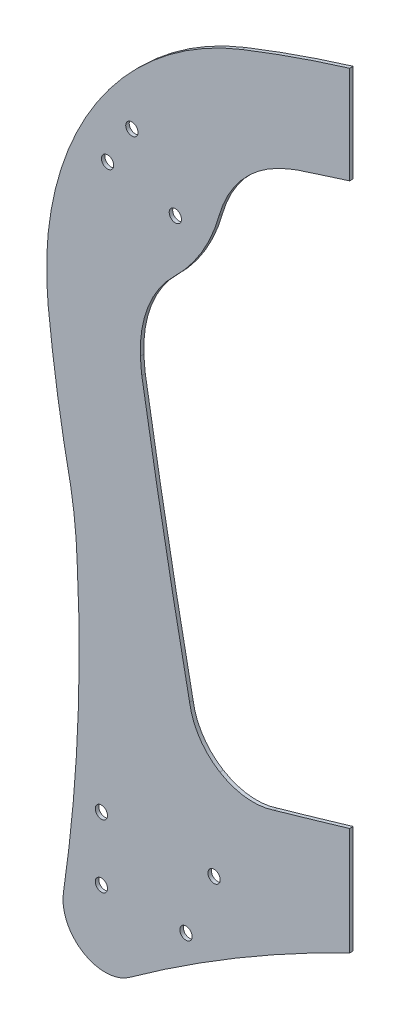
ISO-10303-21;
HEADER;
FILE_DESCRIPTION(('STEP AP214'),'2;1');
FILE_NAME('part.step','',(''),(''),'','','');
FILE_SCHEMA(('AUTOMOTIVE_DESIGN { 1 0 10303 214 1 1 1 1 }'));
ENDSEC;
DATA;
#1=APPLICATION_CONTEXT('core data for automotive mechanical design processes');
#2=APPLICATION_PROTOCOL_DEFINITION('international standard','automotive_design',2000,#1);
#3=PRODUCT_CONTEXT('',#1,'mechanical');
#4=PRODUCT('Part','Part','',(#3));
#5=PRODUCT_RELATED_PRODUCT_CATEGORY('part','',(#4));
#6=PRODUCT_DEFINITION_FORMATION('','',#4);
#7=PRODUCT_DEFINITION_CONTEXT('part definition',#1,'design');
#8=PRODUCT_DEFINITION('design','',#6,#7);
#9=PRODUCT_DEFINITION_SHAPE('','',#8);
#10=(LENGTH_UNIT() NAMED_UNIT(*) SI_UNIT(.MILLI.,.METRE.));
#11=(NAMED_UNIT(*) PLANE_ANGLE_UNIT() SI_UNIT($,.RADIAN.));
#12=(NAMED_UNIT(*) SI_UNIT($,.STERADIAN.) SOLID_ANGLE_UNIT());
#13=UNCERTAINTY_MEASURE_WITH_UNIT(LENGTH_MEASURE(1.E-05),#10,'distance_accuracy_value','');
#14=(GEOMETRIC_REPRESENTATION_CONTEXT(3) GLOBAL_UNCERTAINTY_ASSIGNED_CONTEXT((#13)) GLOBAL_UNIT_ASSIGNED_CONTEXT((#10,
#11,#12)) REPRESENTATION_CONTEXT('',''));
#15=CARTESIAN_POINT('',(0.,0.,0.));
#16=DIRECTION('',(0.,0.,1.));
#17=DIRECTION('',(1.,0.,0.));
#18=AXIS2_PLACEMENT_3D('',#15,#16,#17);
#19=CARTESIAN_POINT('',(-596.9,-624.582509856691,0.));
#20=DIRECTION('',(1.,0.,0.));
#21=DIRECTION('',(0.,0.,-1.));
#22=AXIS2_PLACEMENT_3D('',#19,#20,#21);
#23=PLANE('',#22);
#24=DIRECTION('',(0.,0.,-1.));
#25=VECTOR('',#24,1.);
#26=CARTESIAN_POINT('',(-596.9,-441.82233316805,6.35));
#27=LINE('',#26,#25);
#28=CARTESIAN_POINT('',(-596.9,-441.82233316805,0.));
#29=VERTEX_POINT('',#28);
#30=CARTESIAN_POINT('',(-596.9,-441.82233316805,6.35));
#31=VERTEX_POINT('',#30);
#32=EDGE_CURVE('E262',#29,#31,#27,.F.);
#33=ORIENTED_EDGE('',*,*,#32,.F.);
#34=DIRECTION('',(0.,1.,0.));
#35=VECTOR('',#34,1.);
#36=CARTESIAN_POINT('',(-596.9,-2169.24955294867,0.));
#37=LINE('',#36,#35);
#38=CARTESIAN_POINT('',(-596.9,-246.912409222542,0.));
#39=VERTEX_POINT('',#38);
#40=EDGE_CURVE('E263',#29,#39,#37,.T.);
#41=ORIENTED_EDGE('',*,*,#40,.T.);
#42=DIRECTION('',(0.,0.,-1.));
#43=VECTOR('',#42,1.);
#44=CARTESIAN_POINT('',(-596.9,-246.912409222542,6.35));
#45=LINE('',#44,#43);
#46=CARTESIAN_POINT('',(-596.9,-246.912409222542,6.35));
#47=VERTEX_POINT('',#46);
#48=EDGE_CURVE('E267',#47,#39,#45,.T.);
#49=ORIENTED_EDGE('',*,*,#48,.F.);
#50=DIRECTION('',(0.,1.,0.));
#51=VECTOR('',#50,1.);
#52=CARTESIAN_POINT('',(-596.9,-2169.24955294867,6.35));
#53=LINE('',#52,#51);
#54=EDGE_CURVE('E266',#31,#47,#53,.T.);
#55=ORIENTED_EDGE('',*,*,#54,.F.);
#56=EDGE_LOOP('',(#33,#41,#49,#55));
#57=FACE_BOUND('',#56,.T.);
#58=ADVANCED_FACE('F34',(#57),#23,.T.);
#59=CARTESIAN_POINT('',(-596.9,767.652698165207,0.));
#60=VERTEX_POINT('',#59);
#61=CARTESIAN_POINT('',(-596.9,944.092786482488,0.));
#62=VERTEX_POINT('',#61);
#63=EDGE_CURVE('E274',#60,#62,#37,.T.);
#64=ORIENTED_EDGE('',*,*,#63,.T.);
#65=DIRECTION('',(0.,0.,-1.));
#66=VECTOR('',#65,1.);
#67=CARTESIAN_POINT('',(-596.9,944.092786482488,6.35));
#68=LINE('',#67,#66);
#69=CARTESIAN_POINT('',(-596.9,944.092786482488,6.35));
#70=VERTEX_POINT('',#69);
#71=EDGE_CURVE('E259',#62,#70,#68,.F.);
#72=ORIENTED_EDGE('',*,*,#71,.T.);
#73=CARTESIAN_POINT('',(-596.9,767.652698165207,6.35));
#74=VERTEX_POINT('',#73);
#75=EDGE_CURVE('E38',#74,#70,#53,.T.);
#76=ORIENTED_EDGE('',*,*,#75,.F.);
#77=DIRECTION('',(0.,0.,-1.));
#78=VECTOR('',#77,1.);
#79=CARTESIAN_POINT('',(-596.9,767.652698165207,6.35));
#80=LINE('',#79,#78);
#81=EDGE_CURVE('E264',#60,#74,#80,.F.);
#82=ORIENTED_EDGE('',*,*,#81,.F.);
#83=EDGE_LOOP('',(#64,#72,#76,#82));
#84=FACE_BOUND('',#83,.T.);
#85=ADVANCED_FACE('F409',(#84),#23,.T.);
#86=CARTESIAN_POINT('',(153.596244838655,-1521.42780684033,6.35));
#87=DIRECTION('',(0.,0.,-1.));
#88=DIRECTION('',(-1.,0.,0.));
#89=AXIS2_PLACEMENT_3D('',#86,#87,#88);
#90=CYLINDRICAL_SURFACE('',#89,2577.21485515194);
#91=ORIENTED_EDGE('',*,*,#71,.F.);
#92=CARTESIAN_POINT('',(153.596244838655,-1521.42780684033,0.));
#93=DIRECTION('',(0.,0.,1.));
#94=DIRECTION('',(1.,0.,0.));
#95=AXIS2_PLACEMENT_3D('',#92,#93,#94);
#96=CIRCLE('',#95,2577.21485515194);
#97=CARTESIAN_POINT('',(-791.407826105621,876.280206140935,0.));
#98=VERTEX_POINT('',#97);
#99=EDGE_CURVE('E253',#62,#98,#96,.T.);
#100=ORIENTED_EDGE('',*,*,#99,.T.);
#101=DIRECTION('',(0.,0.,-1.));
#102=VECTOR('',#101,1.);
#103=CARTESIAN_POINT('',(-791.407826105621,876.280206140935,6.35));
#104=LINE('',#103,#102);
#105=CARTESIAN_POINT('',(-791.407826105621,876.280206140935,6.35));
#106=VERTEX_POINT('',#105);
#107=EDGE_CURVE('E311',#106,#98,#104,.T.);
#108=ORIENTED_EDGE('',*,*,#107,.F.);
#109=CARTESIAN_POINT('',(153.596244838655,-1521.42780684033,6.35));
#110=DIRECTION('',(0.,0.,1.));
#111=DIRECTION('',(1.,0.,0.));
#112=AXIS2_PLACEMENT_3D('',#109,#110,#111);
#113=CIRCLE('',#112,2577.21485515194);
#114=EDGE_CURVE('E203',#70,#106,#113,.T.);
#115=ORIENTED_EDGE('',*,*,#114,.F.);
#116=EDGE_LOOP('',(#91,#100,#108,#115));
#117=FACE_BOUND('',#116,.T.);
#118=ADVANCED_FACE('F433',(#117),#90,.T.);
#119=CARTESIAN_POINT('',(577.914172720366,-2865.04040656693,6.35));
#120=DIRECTION('',(0.,0.,-1.));
#121=DIRECTION('',(-1.,0.,0.));
#122=AXIS2_PLACEMENT_3D('',#119,#120,#121);
#123=CYLINDRICAL_SURFACE('',#122,2692.98610684712);
#124=CARTESIAN_POINT('',(577.914172720366,-2865.04040656693,0.));
#125=DIRECTION('',(0.,0.,1.));
#126=DIRECTION('',(1.,0.,0.));
#127=AXIS2_PLACEMENT_3D('',#124,#125,#126);
#128=CIRCLE('',#127,2692.98610684712);
#129=CARTESIAN_POINT('',(-994.915452979234,-679.089551631423,0.));
#130=VERTEX_POINT('',#129);
#131=EDGE_CURVE('E117',#29,#130,#128,.T.);
#132=ORIENTED_EDGE('',*,*,#131,.F.);
#133=ORIENTED_EDGE('',*,*,#32,.T.);
#134=CARTESIAN_POINT('',(577.914172720366,-2865.04040656693,6.35));
#135=DIRECTION('',(0.,0.,1.));
#136=DIRECTION('',(1.,0.,0.));
#137=AXIS2_PLACEMENT_3D('',#134,#135,#136);
#138=CIRCLE('',#137,2692.98610684712);
#139=CARTESIAN_POINT('',(-994.915452979234,-679.089551631423,6.35));
#140=VERTEX_POINT('',#139);
#141=EDGE_CURVE('E192',#31,#140,#138,.T.);
#142=ORIENTED_EDGE('',*,*,#141,.T.);
#143=DIRECTION('',(0.,0.,-1.));
#144=VECTOR('',#143,1.);
#145=CARTESIAN_POINT('',(-994.915452979234,-679.089551631423,6.35));
#146=LINE('',#145,#144);
#147=EDGE_CURVE('E333',#140,#130,#146,.T.);
#148=ORIENTED_EDGE('',*,*,#147,.T.);
#149=EDGE_LOOP('',(#132,#133,#142,#148));
#150=FACE_BOUND('',#149,.T.);
#151=ADVANCED_FACE('F435',(#150),#123,.F.);
#152=CARTESIAN_POINT('',(-4330.12511720553,12331.960297847,6.35));
#153=DIRECTION('',(0.,0.,-1.));
#154=DIRECTION('',(-1.,0.,0.));
#155=AXIS2_PLACEMENT_3D('',#152,#153,#154);
#156=CYLINDRICAL_SURFACE('',#155,13121.1664251465);
#157=CARTESIAN_POINT('',(-4330.12511720553,12331.960297847,6.35));
#158=DIRECTION('',(0.,0.,1.));
#159=DIRECTION('',(1.,0.,0.));
#160=AXIS2_PLACEMENT_3D('',#157,#158,#159);
#161=CIRCLE('',#160,13121.1664251465);
#162=CARTESIAN_POINT('',(-734.160728685571,-286.837127933736,6.35));
#163=VERTEX_POINT('',#162);
#164=EDGE_CURVE('E248',#163,#47,#161,.T.);
#165=ORIENTED_EDGE('',*,*,#164,.T.);
#166=ORIENTED_EDGE('',*,*,#48,.T.);
#167=CARTESIAN_POINT('',(-4330.12511720553,12331.960297847,0.));
#168=DIRECTION('',(0.,0.,1.));
#169=DIRECTION('',(1.,0.,0.));
#170=AXIS2_PLACEMENT_3D('',#167,#168,#169);
#171=CIRCLE('',#170,13121.1664251465);
#172=CARTESIAN_POINT('',(-734.160728685571,-286.837127933736,0.));
#173=VERTEX_POINT('',#172);
#174=EDGE_CURVE('E11',#173,#39,#171,.T.);
#175=ORIENTED_EDGE('',*,*,#174,.F.);
#176=DIRECTION('',(0.,0.,-1.));
#177=VECTOR('',#176,1.);
#178=CARTESIAN_POINT('',(-734.160728685571,-286.837127933736,6.35));
#179=LINE('',#178,#177);
#180=EDGE_CURVE('E53',#163,#173,#179,.T.);
#181=ORIENTED_EDGE('',*,*,#180,.F.);
#182=EDGE_LOOP('',(#165,#166,#175,#181));
#183=FACE_BOUND('',#182,.T.);
#184=ADVANCED_FACE('F282',(#183),#156,.F.);
#185=CARTESIAN_POINT('',(3360.15803335572,-11742.6110911019,6.35));
#186=DIRECTION('',(0.,0.,-1.));
#187=DIRECTION('',(-1.,0.,0.));
#188=AXIS2_PLACEMENT_3D('',#185,#186,#187);
#189=CYLINDRICAL_SURFACE('',#188,13121.1664251465);
#190=CARTESIAN_POINT('',(3360.15803335572,-11742.6110911019,0.));
#191=DIRECTION('',(0.,0.,1.));
#192=DIRECTION('',(1.,0.,0.));
#193=AXIS2_PLACEMENT_3D('',#190,#191,#192);
#194=CIRCLE('',#193,13121.1664251465);
#195=CARTESIAN_POINT('',(-691.89063245382,737.209018431093,0.));
#196=VERTEX_POINT('',#195);
#197=EDGE_CURVE('E249',#60,#196,#194,.T.);
#198=ORIENTED_EDGE('',*,*,#197,.F.);
#199=ORIENTED_EDGE('',*,*,#81,.T.);
#200=CARTESIAN_POINT('',(3360.15803335572,-11742.6110911019,6.35));
#201=DIRECTION('',(0.,0.,1.));
#202=DIRECTION('',(1.,0.,0.));
#203=AXIS2_PLACEMENT_3D('',#200,#201,#202);
#204=CIRCLE('',#203,13121.1664251465);
#205=CARTESIAN_POINT('',(-691.89063245382,737.209018431093,6.35));
#206=VERTEX_POINT('',#205);
#207=EDGE_CURVE('E225',#74,#206,#204,.T.);
#208=ORIENTED_EDGE('',*,*,#207,.T.);
#209=DIRECTION('',(0.,0.,-1.));
#210=VECTOR('',#209,1.);
#211=CARTESIAN_POINT('',(-691.89063245382,737.209018431093,6.35));
#212=LINE('',#211,#210);
#213=EDGE_CURVE('E273',#206,#196,#212,.T.);
#214=ORIENTED_EDGE('',*,*,#213,.T.);
#215=EDGE_LOOP('',(#198,#199,#208,#214));
#216=FACE_BOUND('',#215,.T.);
#217=ADVANCED_FACE('F403',(#216),#189,.F.);
#218=CARTESIAN_POINT('',(-10.0304702545167,-2169.24955294867,6.35));
#219=DIRECTION('',(0.,0.,1.));
#220=DIRECTION('',(1.,0.,0.));
#221=AXIS2_PLACEMENT_3D('',#218,#219,#220);
#222=PLANE('',#221);
#223=CARTESIAN_POINT('',(-842.317492798119,-444.618230590805,6.35));
#224=DIRECTION('',(0.,0.,1.));
#225=DIRECTION('',(1.,0.,0.));
#226=AXIS2_PLACEMENT_3D('',#223,#224,#225);
#227=CIRCLE('',#226,11.1124999999994);
#228=CARTESIAN_POINT('',(-831.20499279812,-444.618230590805,6.35));
#229=VERTEX_POINT('',#228);
#230=EDGE_CURVE('E222',#229,#229,#227,.T.);
#231=ORIENTED_EDGE('',*,*,#230,.F.);
#232=EDGE_LOOP('',(#231));
#233=FACE_BOUND('',#232,.T.);
#234=CARTESIAN_POINT('',(-893.117492798119,-558.918230590805,6.35));
#235=DIRECTION('',(0.,0.,1.));
#236=DIRECTION('',(1.,0.,0.));
#237=AXIS2_PLACEMENT_3D('',#234,#235,#236);
#238=CIRCLE('',#237,11.1124999999994);
#239=CARTESIAN_POINT('',(-882.004992798119,-558.918230590805,6.35));
#240=VERTEX_POINT('',#239);
#241=EDGE_CURVE('E219',#240,#240,#238,.T.);
#242=ORIENTED_EDGE('',*,*,#241,.F.);
#243=EDGE_LOOP('',(#242));
#244=FACE_BOUND('',#243,.T.);
#245=CARTESIAN_POINT('',(-1046.16708396435,-445.853855558227,6.35));
#246=DIRECTION('',(0.,0.,1.));
#247=DIRECTION('',(1.,0.,0.));
#248=AXIS2_PLACEMENT_3D('',#245,#246,#247);
#249=CIRCLE('',#248,11.1124999999994);
#250=CARTESIAN_POINT('',(-1035.05458396435,-445.853855558227,6.35));
#251=VERTEX_POINT('',#250);
#252=EDGE_CURVE('E216',#251,#251,#249,.T.);
#253=ORIENTED_EDGE('',*,*,#252,.F.);
#254=EDGE_LOOP('',(#253));
#255=FACE_BOUND('',#254,.T.);
#256=CARTESIAN_POINT('',(-1046.16708396435,-560.153855558227,6.35));
#257=DIRECTION('',(0.,0.,1.));
#258=DIRECTION('',(1.,0.,0.));
#259=AXIS2_PLACEMENT_3D('',#256,#257,#258);
#260=CIRCLE('',#259,11.1124999999994);
#261=CARTESIAN_POINT('',(-1035.05458396435,-560.153855558227,6.35));
#262=VERTEX_POINT('',#261);
#263=EDGE_CURVE('E213',#262,#262,#260,.T.);
#264=ORIENTED_EDGE('',*,*,#263,.F.);
#265=EDGE_LOOP('',(#264));
#266=FACE_BOUND('',#265,.T.);
#267=CARTESIAN_POINT('',(-912.392953219633,555.218585094677,6.35));
#268=DIRECTION('',(0.,0.,1.));
#269=DIRECTION('',(1.,0.,0.));
#270=AXIS2_PLACEMENT_3D('',#267,#268,#269);
#271=CIRCLE('',#270,11.1125000000003);
#272=CARTESIAN_POINT('',(-901.280453219632,555.218585094677,6.35));
#273=VERTEX_POINT('',#272);
#274=EDGE_CURVE('E210',#273,#273,#271,.T.);
#275=ORIENTED_EDGE('',*,*,#274,.F.);
#276=EDGE_LOOP('',(#275));
#277=FACE_BOUND('',#276,.T.);
#278=CARTESIAN_POINT('',(-991.017480219273,652.045444179052,6.35));
#279=DIRECTION('',(0.,0.,1.));
#280=DIRECTION('',(1.,0.,0.));
#281=AXIS2_PLACEMENT_3D('',#278,#279,#280);
#282=CIRCLE('',#281,11.1125000000003);
#283=CARTESIAN_POINT('',(-979.904980219272,652.045444179052,6.35));
#284=VERTEX_POINT('',#283);
#285=EDGE_CURVE('E207',#284,#284,#282,.T.);
#286=ORIENTED_EDGE('',*,*,#285,.F.);
#287=EDGE_LOOP('',(#286));
#288=FACE_BOUND('',#287,.T.);
#289=CARTESIAN_POINT('',(-1034.96338078354,578.321554013371,6.35));
#290=DIRECTION('',(0.,0.,1.));
#291=DIRECTION('',(1.,0.,0.));
#292=AXIS2_PLACEMENT_3D('',#289,#290,#291);
#293=CIRCLE('',#292,11.1125000000003);
#294=CARTESIAN_POINT('',(-1023.85088078354,578.321554013371,6.35));
#295=VERTEX_POINT('',#294);
#296=EDGE_CURVE('E204',#295,#295,#293,.T.);
#297=ORIENTED_EDGE('',*,*,#296,.F.);
#298=EDGE_LOOP('',(#297));
#299=FACE_BOUND('',#298,.T.);
#300=ORIENTED_EDGE('',*,*,#141,.F.);
#301=ORIENTED_EDGE('',*,*,#54,.T.);
#302=ORIENTED_EDGE('',*,*,#164,.F.);
#303=CARTESIAN_POINT('',(-771.519777385869,-176.749160683128,6.35));
#304=DIRECTION('',(0.,0.,1.));
#305=DIRECTION('',(1.,0.,0.));
#306=AXIS2_PLACEMENT_3D('',#303,#304,#305);
#307=CIRCLE('',#306,116.254286171144);
#308=CARTESIAN_POINT('',(-831.914958660733,-276.084356520062,6.35));
#309=VERTEX_POINT('',#308);
#310=EDGE_CURVE('E246',#309,#163,#307,.T.);
#311=ORIENTED_EDGE('',*,*,#310,.F.);
#312=DIRECTION('',(0.854464804067926,-0.519509286355077,0.));
#313=VECTOR('',#312,1.);
#314=CARTESIAN_POINT('',(608.531783884307,-1151.86701683498,6.35));
#315=LINE('',#314,#313);
#316=CARTESIAN_POINT('',(-832.041240205875,-276.00757812605,6.35));
#317=VERTEX_POINT('',#316);
#318=EDGE_CURVE('E244',#317,#309,#315,.T.);
#319=ORIENTED_EDGE('',*,*,#318,.F.);
#320=CARTESIAN_POINT('',(-771.64605893101,-176.672382289116,6.35));
#321=DIRECTION('',(0.,0.,1.));
#322=DIRECTION('',(1.,0.,0.));
#323=AXIS2_PLACEMENT_3D('',#320,#321,#322);
#324=CIRCLE('',#323,116.254286171246);
#325=CARTESIAN_POINT('',(-886.576073784728,-194.169546028132,6.35));
#326=VERTEX_POINT('',#325);
#327=EDGE_CURVE('E167',#326,#317,#324,.T.);
#328=ORIENTED_EDGE('',*,*,#327,.F.);
#329=CARTESIAN_POINT('',(11971.3883272862,2420.74150737003,6.35));
#330=DIRECTION('',(0.,0.,1.));
#331=DIRECTION('',(1.,0.,0.));
#332=AXIS2_PLACEMENT_3D('',#329,#330,#331);
#333=CIRCLE('',#332,13121.1664251464);
#334=CARTESIAN_POINT('',(-973.090543461927,274.704433798743,6.35));
#335=VERTEX_POINT('',#334);
#336=EDGE_CURVE('E240',#335,#326,#333,.T.);
#337=ORIENTED_EDGE('',*,*,#336,.F.);
#338=CARTESIAN_POINT('',(-536.88973086258,325.638726740605,6.35));
#339=DIRECTION('',(0.,0.,1.));
#340=DIRECTION('',(1.,0.,0.));
#341=AXIS2_PLACEMENT_3D('',#338,#339,#340);
#342=CIRCLE('',#341,439.164492086756);
#343=CARTESIAN_POINT('',(-975.513775636944,303.858036770023,6.35));
#344=VERTEX_POINT('',#343);
#345=EDGE_CURVE('E237',#344,#335,#342,.T.);
#346=ORIENTED_EDGE('',*,*,#345,.F.);
#347=CARTESIAN_POINT('',(-772.563838872597,313.935892065246,6.35));
#348=DIRECTION('',(0.,0.,1.));
#349=DIRECTION('',(1.,0.,0.));
#350=AXIS2_PLACEMENT_3D('',#347,#348,#349);
#351=CIRCLE('',#350,203.200000000007);
#352=CARTESIAN_POINT('',(-913.897564598035,459.932528918868,6.35));
#353=VERTEX_POINT('',#352);
#354=EDGE_CURVE('E234',#353,#344,#351,.T.);
#355=ORIENTED_EDGE('',*,*,#354,.F.);
#356=CARTESIAN_POINT('',(-1123.81077439673,676.771238183477,6.35));
#357=DIRECTION('',(0.,0.,1.));
#358=DIRECTION('',(1.,0.,0.));
#359=AXIS2_PLACEMENT_3D('',#356,#357,#358);
#360=CIRCLE('',#359,301.798909016469);
#361=CARTESIAN_POINT('',(-833.367311335823,594.764066248819,6.35));
#362=VERTEX_POINT('',#361);
#363=EDGE_CURVE('E232',#353,#362,#360,.T.);
#364=ORIENTED_EDGE('',*,*,#363,.T.);
#365=CARTESIAN_POINT('',(-637.812887741983,539.54896493695,6.35));
#366=DIRECTION('',(0.,0.,1.));
#367=DIRECTION('',(1.,0.,0.));
#368=AXIS2_PLACEMENT_3D('',#365,#366,#367);
#369=CIRCLE('',#368,203.199999999998);
#370=CARTESIAN_POINT('',(-725.177038409833,723.009438004269,6.35));
#371=VERTEX_POINT('',#370);
#372=EDGE_CURVE('E229',#371,#362,#369,.T.);
#373=ORIENTED_EDGE('',*,*,#372,.F.);
#374=CARTESIAN_POINT('',(-536.361916093608,326.506852017079,6.35));
#375=DIRECTION('',(0.,0.,1.));
#376=DIRECTION('',(1.,0.,0.));
#377=AXIS2_PLACEMENT_3D('',#374,#375,#376);
#378=CIRCLE('',#377,439.164492086757);
#379=EDGE_CURVE('E226',#206,#371,#378,.T.);
#380=ORIENTED_EDGE('',*,*,#379,.F.);
#381=ORIENTED_EDGE('',*,*,#207,.F.);
#382=ORIENTED_EDGE('',*,*,#75,.T.);
#383=ORIENTED_EDGE('',*,*,#114,.T.);
#384=CARTESIAN_POINT('',(-586.509009157058,356.401456033668,6.35));
#385=DIRECTION('',(0.,0.,1.));
#386=DIRECTION('',(1.,0.,0.));
#387=AXIS2_PLACEMENT_3D('',#384,#385,#386);
#388=CIRCLE('',#387,558.800000000013);
#389=CARTESIAN_POINT('',(-1142.35843464081,299.052906013671,6.35));
#390=VERTEX_POINT('',#389);
#391=EDGE_CURVE('E200',#106,#390,#388,.T.);
#392=ORIENTED_EDGE('',*,*,#391,.T.);
#393=CARTESIAN_POINT('',(1421.24821636957,563.54742110072,6.35));
#394=DIRECTION('',(0.,0.,1.));
#395=DIRECTION('',(1.,0.,0.));
#396=AXIS2_PLACEMENT_3D('',#393,#394,#395);
#397=CIRCLE('',#396,2577.21485515194);
#398=CARTESIAN_POINT('',(-1101.53128595536,36.6508541495265,6.35));
#399=VERTEX_POINT('',#398);
#400=EDGE_CURVE('E198',#390,#399,#397,.T.);
#401=ORIENTED_EDGE('',*,*,#400,.T.);
#402=CARTESIAN_POINT('',(-1914.92938311946,-103.947752173305,6.35));
#403=DIRECTION('',(0.,0.,1.));
#404=DIRECTION('',(1.,0.,0.));
#405=AXIS2_PLACEMENT_3D('',#402,#403,#404);
#406=CIRCLE('',#405,825.46013384663);
#407=CARTESIAN_POINT('',(-1089.83566214046,-79.3553921580195,6.35));
#408=VERTEX_POINT('',#407);
#409=EDGE_CURVE('E195',#408,#399,#406,.T.);
#410=ORIENTED_EDGE('',*,*,#409,.F.);
#411=CARTESIAN_POINT('',(-3779.36069972374,-215.84438029698,6.35));
#412=DIRECTION('',(0.,0.,1.));
#413=DIRECTION('',(1.,0.,0.));
#414=AXIS2_PLACEMENT_3D('',#411,#412,#413);
#415=CIRCLE('',#414,2692.98610684712);
#416=CARTESIAN_POINT('',(-1114.81506697147,-606.191331934103,6.35));
#417=VERTEX_POINT('',#416);
#418=EDGE_CURVE('E191',#417,#408,#415,.T.);
#419=ORIENTED_EDGE('',*,*,#418,.F.);
#420=CARTESIAN_POINT('',(-1039.41981086547,-617.236482757399,6.35));
#421=DIRECTION('',(0.,0.,1.));
#422=DIRECTION('',(1.,0.,0.));
#423=AXIS2_PLACEMENT_3D('',#420,#421,#422);
#424=CIRCLE('',#423,76.1999999999967);
#425=EDGE_CURVE('E188',#417,#140,#424,.T.);
#426=ORIENTED_EDGE('',*,*,#425,.T.);
#427=EDGE_LOOP('',(#300,#301,#302,#311,#319,#328,#337,#346,#355,#364,#373,#380,#381,#382,#383,
#392,#401,#410,#419,#426));
#428=FACE_BOUND('',#427,.T.);
#429=ADVANCED_FACE('F36',(#233,#244,#255,#266,#277,#288,#299,#428),#222,.T.);
#430=CARTESIAN_POINT('',(-10.0304702545167,-2169.24955294867,0.));
#431=DIRECTION('',(0.,0.,1.));
#432=DIRECTION('',(1.,0.,0.));
#433=AXIS2_PLACEMENT_3D('',#430,#431,#432);
#434=PLANE('',#433);
#435=CARTESIAN_POINT('',(-842.317492798119,-444.618230590805,0.));
#436=DIRECTION('',(0.,0.,1.));
#437=DIRECTION('',(1.,0.,0.));
#438=AXIS2_PLACEMENT_3D('',#435,#436,#437);
#439=CIRCLE('',#438,11.1124999999994);
#440=CARTESIAN_POINT('',(-831.20499279812,-444.618230590805,0.));
#441=VERTEX_POINT('',#440);
#442=EDGE_CURVE('E252',#441,#441,#439,.T.);
#443=ORIENTED_EDGE('',*,*,#442,.T.);
#444=EDGE_LOOP('',(#443));
#445=FACE_BOUND('',#444,.T.);
#446=CARTESIAN_POINT('',(-893.117492798119,-558.918230590805,0.));
#447=DIRECTION('',(0.,0.,1.));
#448=DIRECTION('',(1.,0.,0.));
#449=AXIS2_PLACEMENT_3D('',#446,#447,#448);
#450=CIRCLE('',#449,11.1124999999994);
#451=CARTESIAN_POINT('',(-882.004992798119,-558.918230590805,0.));
#452=VERTEX_POINT('',#451);
#453=EDGE_CURVE('E361',#452,#452,#450,.T.);
#454=ORIENTED_EDGE('',*,*,#453,.T.);
#455=EDGE_LOOP('',(#454));
#456=FACE_BOUND('',#455,.T.);
#457=CARTESIAN_POINT('',(-1046.16708396435,-445.853855558227,0.));
#458=DIRECTION('',(0.,0.,1.));
#459=DIRECTION('',(1.,0.,0.));
#460=AXIS2_PLACEMENT_3D('',#457,#458,#459);
#461=CIRCLE('',#460,11.1124999999994);
#462=CARTESIAN_POINT('',(-1035.05458396435,-445.853855558227,0.));
#463=VERTEX_POINT('',#462);
#464=EDGE_CURVE('E358',#463,#463,#461,.T.);
#465=ORIENTED_EDGE('',*,*,#464,.T.);
#466=EDGE_LOOP('',(#465));
#467=FACE_BOUND('',#466,.T.);
#468=CARTESIAN_POINT('',(-1046.16708396435,-560.153855558227,0.));
#469=DIRECTION('',(0.,0.,1.));
#470=DIRECTION('',(1.,0.,0.));
#471=AXIS2_PLACEMENT_3D('',#468,#469,#470);
#472=CIRCLE('',#471,11.1124999999994);
#473=CARTESIAN_POINT('',(-1035.05458396435,-560.153855558227,0.));
#474=VERTEX_POINT('',#473);
#475=EDGE_CURVE('E355',#474,#474,#472,.T.);
#476=ORIENTED_EDGE('',*,*,#475,.T.);
#477=EDGE_LOOP('',(#476));
#478=FACE_BOUND('',#477,.T.);
#479=CARTESIAN_POINT('',(-912.392953219633,555.218585094677,0.));
#480=DIRECTION('',(0.,0.,1.));
#481=DIRECTION('',(1.,0.,0.));
#482=AXIS2_PLACEMENT_3D('',#479,#480,#481);
#483=CIRCLE('',#482,11.1125000000003);
#484=CARTESIAN_POINT('',(-901.280453219632,555.218585094677,0.));
#485=VERTEX_POINT('',#484);
#486=EDGE_CURVE('E352',#485,#485,#483,.T.);
#487=ORIENTED_EDGE('',*,*,#486,.T.);
#488=EDGE_LOOP('',(#487));
#489=FACE_BOUND('',#488,.T.);
#490=CARTESIAN_POINT('',(-991.017480219273,652.045444179052,0.));
#491=DIRECTION('',(0.,0.,1.));
#492=DIRECTION('',(1.,0.,0.));
#493=AXIS2_PLACEMENT_3D('',#490,#491,#492);
#494=CIRCLE('',#493,11.1125000000003);
#495=CARTESIAN_POINT('',(-979.904980219272,652.045444179052,0.));
#496=VERTEX_POINT('',#495);
#497=EDGE_CURVE('E349',#496,#496,#494,.T.);
#498=ORIENTED_EDGE('',*,*,#497,.T.);
#499=EDGE_LOOP('',(#498));
#500=FACE_BOUND('',#499,.T.);
#501=CARTESIAN_POINT('',(-1034.96338078354,578.321554013371,0.));
#502=DIRECTION('',(0.,0.,1.));
#503=DIRECTION('',(1.,0.,0.));
#504=AXIS2_PLACEMENT_3D('',#501,#502,#503);
#505=CIRCLE('',#504,11.1125000000003);
#506=CARTESIAN_POINT('',(-1023.85088078354,578.321554013371,0.));
#507=VERTEX_POINT('',#506);
#508=EDGE_CURVE('E255',#507,#507,#505,.T.);
#509=ORIENTED_EDGE('',*,*,#508,.T.);
#510=EDGE_LOOP('',(#509));
#511=FACE_BOUND('',#510,.T.);
#512=ORIENTED_EDGE('',*,*,#40,.F.);
#513=ORIENTED_EDGE('',*,*,#131,.T.);
#514=CARTESIAN_POINT('',(-1039.41981086547,-617.236482757399,0.));
#515=DIRECTION('',(0.,0.,1.));
#516=DIRECTION('',(1.,0.,0.));
#517=AXIS2_PLACEMENT_3D('',#514,#515,#516);
#518=CIRCLE('',#517,76.1999999999967);
#519=CARTESIAN_POINT('',(-1114.81506697147,-606.191331934103,0.));
#520=VERTEX_POINT('',#519);
#521=EDGE_CURVE('E270',#520,#130,#518,.T.);
#522=ORIENTED_EDGE('',*,*,#521,.F.);
#523=CARTESIAN_POINT('',(-3779.36069972374,-215.84438029698,0.));
#524=DIRECTION('',(0.,0.,1.));
#525=DIRECTION('',(1.,0.,0.));
#526=AXIS2_PLACEMENT_3D('',#523,#524,#525);
#527=CIRCLE('',#526,2692.98610684712);
#528=CARTESIAN_POINT('',(-1089.83566214046,-79.3553921580195,0.));
#529=VERTEX_POINT('',#528);
#530=EDGE_CURVE('E337',#520,#529,#527,.T.);
#531=ORIENTED_EDGE('',*,*,#530,.T.);
#532=CARTESIAN_POINT('',(-1914.92938311946,-103.947752173305,0.));
#533=DIRECTION('',(0.,0.,1.));
#534=DIRECTION('',(1.,0.,0.));
#535=AXIS2_PLACEMENT_3D('',#532,#533,#534);
#536=CIRCLE('',#535,825.46013384663);
#537=CARTESIAN_POINT('',(-1101.53128595536,36.6508541495265,0.));
#538=VERTEX_POINT('',#537);
#539=EDGE_CURVE('E340',#529,#538,#536,.T.);
#540=ORIENTED_EDGE('',*,*,#539,.T.);
#541=CARTESIAN_POINT('',(1421.24821636957,563.54742110072,0.));
#542=DIRECTION('',(0.,0.,1.));
#543=DIRECTION('',(1.,0.,0.));
#544=AXIS2_PLACEMENT_3D('',#541,#542,#543);
#545=CIRCLE('',#544,2577.21485515194);
#546=CARTESIAN_POINT('',(-1142.35843464081,299.052906013671,0.));
#547=VERTEX_POINT('',#546);
#548=EDGE_CURVE('E343',#547,#538,#545,.T.);
#549=ORIENTED_EDGE('',*,*,#548,.F.);
#550=CARTESIAN_POINT('',(-586.509009157058,356.401456033668,0.));
#551=DIRECTION('',(0.,0.,1.));
#552=DIRECTION('',(1.,0.,0.));
#553=AXIS2_PLACEMENT_3D('',#550,#551,#552);
#554=CIRCLE('',#553,558.800000000013);
#555=EDGE_CURVE('E256',#98,#547,#554,.T.);
#556=ORIENTED_EDGE('',*,*,#555,.F.);
#557=ORIENTED_EDGE('',*,*,#99,.F.);
#558=ORIENTED_EDGE('',*,*,#63,.F.);
#559=ORIENTED_EDGE('',*,*,#197,.T.);
#560=CARTESIAN_POINT('',(-536.361916093608,326.506852017079,0.));
#561=DIRECTION('',(0.,0.,1.));
#562=DIRECTION('',(1.,0.,0.));
#563=AXIS2_PLACEMENT_3D('',#560,#561,#562);
#564=CIRCLE('',#563,439.164492086757);
#565=CARTESIAN_POINT('',(-725.177038409833,723.009438004269,0.));
#566=VERTEX_POINT('',#565);
#567=EDGE_CURVE('E251',#196,#566,#564,.T.);
#568=ORIENTED_EDGE('',*,*,#567,.T.);
#569=CARTESIAN_POINT('',(-637.812887741983,539.54896493695,0.));
#570=DIRECTION('',(0.,0.,1.));
#571=DIRECTION('',(1.,0.,0.));
#572=AXIS2_PLACEMENT_3D('',#569,#570,#571);
#573=CIRCLE('',#572,203.199999999998);
#574=CARTESIAN_POINT('',(-833.367311335823,594.764066248819,0.));
#575=VERTEX_POINT('',#574);
#576=EDGE_CURVE('E368',#566,#575,#573,.T.);
#577=ORIENTED_EDGE('',*,*,#576,.T.);
#578=CARTESIAN_POINT('',(-1123.81077439673,676.771238183477,0.));
#579=DIRECTION('',(0.,0.,1.));
#580=DIRECTION('',(1.,0.,0.));
#581=AXIS2_PLACEMENT_3D('',#578,#579,#580);
#582=CIRCLE('',#581,301.798909016469);
#583=CARTESIAN_POINT('',(-913.897564598035,459.932528918868,0.));
#584=VERTEX_POINT('',#583);
#585=EDGE_CURVE('E371',#584,#575,#582,.T.);
#586=ORIENTED_EDGE('',*,*,#585,.F.);
#587=CARTESIAN_POINT('',(-772.563838872597,313.935892065246,0.));
#588=DIRECTION('',(0.,0.,1.));
#589=DIRECTION('',(1.,0.,0.));
#590=AXIS2_PLACEMENT_3D('',#587,#588,#589);
#591=CIRCLE('',#590,203.200000000007);
#592=CARTESIAN_POINT('',(-975.513775636944,303.858036770023,0.));
#593=VERTEX_POINT('',#592);
#594=EDGE_CURVE('E374',#584,#593,#591,.T.);
#595=ORIENTED_EDGE('',*,*,#594,.T.);
#596=CARTESIAN_POINT('',(-536.88973086258,325.638726740605,0.));
#597=DIRECTION('',(0.,0.,1.));
#598=DIRECTION('',(1.,0.,0.));
#599=AXIS2_PLACEMENT_3D('',#596,#597,#598);
#600=CIRCLE('',#599,439.164492086756);
#601=CARTESIAN_POINT('',(-973.090543461927,274.704433798743,0.));
#602=VERTEX_POINT('',#601);
#603=EDGE_CURVE('E183',#593,#602,#600,.T.);
#604=ORIENTED_EDGE('',*,*,#603,.T.);
#605=CARTESIAN_POINT('',(11971.3883272862,2420.74150737003,0.));
#606=DIRECTION('',(0.,0.,1.));
#607=DIRECTION('',(1.,0.,0.));
#608=AXIS2_PLACEMENT_3D('',#605,#606,#607);
#609=CIRCLE('',#608,13121.1664251464);
#610=CARTESIAN_POINT('',(-886.576073784728,-194.169546028132,0.));
#611=VERTEX_POINT('',#610);
#612=EDGE_CURVE('E181',#602,#611,#609,.T.);
#613=ORIENTED_EDGE('',*,*,#612,.T.);
#614=CARTESIAN_POINT('',(-771.64605893101,-176.672382289116,0.));
#615=DIRECTION('',(0.,0.,1.));
#616=DIRECTION('',(1.,0.,0.));
#617=AXIS2_PLACEMENT_3D('',#614,#615,#616);
#618=CIRCLE('',#617,116.254286171246);
#619=CARTESIAN_POINT('',(-832.041240205875,-276.00757812605,0.));
#620=VERTEX_POINT('',#619);
#621=EDGE_CURVE('E164',#611,#620,#618,.T.);
#622=ORIENTED_EDGE('',*,*,#621,.T.);
#623=DIRECTION('',(0.854464804067926,-0.519509286355077,0.));
#624=VECTOR('',#623,1.);
#625=CARTESIAN_POINT('',(608.531783884307,-1151.86701683498,0.));
#626=LINE('',#625,#624);
#627=CARTESIAN_POINT('',(-831.914958660733,-276.084356520062,0.));
#628=VERTEX_POINT('',#627);
#629=EDGE_CURVE('E174',#620,#628,#626,.T.);
#630=ORIENTED_EDGE('',*,*,#629,.T.);
#631=CARTESIAN_POINT('',(-771.519777385869,-176.749160683128,0.));
#632=DIRECTION('',(0.,0.,1.));
#633=DIRECTION('',(1.,0.,0.));
#634=AXIS2_PLACEMENT_3D('',#631,#632,#633);
#635=CIRCLE('',#634,116.254286171144);
#636=EDGE_CURVE('E44',#628,#173,#635,.T.);
#637=ORIENTED_EDGE('',*,*,#636,.T.);
#638=ORIENTED_EDGE('',*,*,#174,.T.);
#639=EDGE_LOOP('',(#512,#513,#522,#531,#540,#549,#556,#557,#558,#559,#568,#577,#586,#595,#604,
#613,#622,#630,#637,#638));
#640=FACE_BOUND('',#639,.T.);
#641=ADVANCED_FACE('F178',(#445,#456,#467,#478,#489,#500,#511,#640),#434,.F.);
#642=CARTESIAN_POINT('',(-586.509009157058,356.401456033668,6.35));
#643=DIRECTION('',(0.,0.,-1.));
#644=DIRECTION('',(-1.,0.,0.));
#645=AXIS2_PLACEMENT_3D('',#642,#643,#644);
#646=CYLINDRICAL_SURFACE('',#645,558.800000000013);
#647=ORIENTED_EDGE('',*,*,#555,.T.);
#648=DIRECTION('',(0.,0.,-1.));
#649=VECTOR('',#648,1.);
#650=CARTESIAN_POINT('',(-1142.35843464081,299.052906013671,6.35));
#651=LINE('',#650,#649);
#652=EDGE_CURVE('E316',#390,#547,#651,.T.);
#653=ORIENTED_EDGE('',*,*,#652,.F.);
#654=ORIENTED_EDGE('',*,*,#391,.F.);
#655=ORIENTED_EDGE('',*,*,#107,.T.);
#656=EDGE_LOOP('',(#647,#653,#654,#655));
#657=FACE_BOUND('',#656,.T.);
#658=ADVANCED_FACE('F452',(#657),#646,.T.);
#659=CARTESIAN_POINT('',(1421.24821636957,563.54742110072,6.35));
#660=DIRECTION('',(0.,0.,-1.));
#661=DIRECTION('',(-1.,0.,0.));
#662=AXIS2_PLACEMENT_3D('',#659,#660,#661);
#663=CYLINDRICAL_SURFACE('',#662,2577.21485515194);
#664=ORIENTED_EDGE('',*,*,#548,.T.);
#665=DIRECTION('',(0.,0.,-1.));
#666=VECTOR('',#665,1.);
#667=CARTESIAN_POINT('',(-1101.53128595536,36.6508541495265,6.35));
#668=LINE('',#667,#666);
#669=EDGE_CURVE('E323',#399,#538,#668,.T.);
#670=ORIENTED_EDGE('',*,*,#669,.F.);
#671=ORIENTED_EDGE('',*,*,#400,.F.);
#672=ORIENTED_EDGE('',*,*,#652,.T.);
#673=EDGE_LOOP('',(#664,#670,#671,#672));
#674=FACE_BOUND('',#673,.T.);
#675=ADVANCED_FACE('F458',(#674),#663,.T.);
#676=CARTESIAN_POINT('',(-1914.92938311946,-103.947752173305,6.35));
#677=DIRECTION('',(0.,0.,-1.));
#678=DIRECTION('',(-1.,0.,0.));
#679=AXIS2_PLACEMENT_3D('',#676,#677,#678);
#680=CYLINDRICAL_SURFACE('',#679,825.46013384663);
#681=ORIENTED_EDGE('',*,*,#539,.F.);
#682=DIRECTION('',(0.,0.,-1.));
#683=VECTOR('',#682,1.);
#684=CARTESIAN_POINT('',(-1089.83566214046,-79.3553921580195,6.35));
#685=LINE('',#684,#683);
#686=EDGE_CURVE('E329',#408,#529,#685,.T.);
#687=ORIENTED_EDGE('',*,*,#686,.F.);
#688=ORIENTED_EDGE('',*,*,#409,.T.);
#689=ORIENTED_EDGE('',*,*,#669,.T.);
#690=EDGE_LOOP('',(#681,#687,#688,#689));
#691=FACE_BOUND('',#690,.T.);
#692=ADVANCED_FACE('F492',(#691),#680,.F.);
#693=CARTESIAN_POINT('',(-3779.36069972374,-215.84438029698,6.35));
#694=DIRECTION('',(0.,0.,-1.));
#695=DIRECTION('',(-1.,0.,0.));
#696=AXIS2_PLACEMENT_3D('',#693,#694,#695);
#697=CYLINDRICAL_SURFACE('',#696,2692.98610684712);
#698=ORIENTED_EDGE('',*,*,#530,.F.);
#699=DIRECTION('',(0.,0.,-1.));
#700=VECTOR('',#699,1.);
#701=CARTESIAN_POINT('',(-1114.81506697147,-606.191331934103,6.35));
#702=LINE('',#701,#700);
#703=EDGE_CURVE('E331',#417,#520,#702,.T.);
#704=ORIENTED_EDGE('',*,*,#703,.F.);
#705=ORIENTED_EDGE('',*,*,#418,.T.);
#706=ORIENTED_EDGE('',*,*,#686,.T.);
#707=EDGE_LOOP('',(#698,#704,#705,#706));
#708=FACE_BOUND('',#707,.T.);
#709=ADVANCED_FACE('F430',(#708),#697,.F.);
#710=CARTESIAN_POINT('',(-1039.41981086547,-617.236482757399,6.35));
#711=DIRECTION('',(0.,0.,-1.));
#712=DIRECTION('',(-1.,0.,0.));
#713=AXIS2_PLACEMENT_3D('',#710,#711,#712);
#714=CYLINDRICAL_SURFACE('',#713,76.1999999999967);
#715=ORIENTED_EDGE('',*,*,#521,.T.);
#716=ORIENTED_EDGE('',*,*,#147,.F.);
#717=ORIENTED_EDGE('',*,*,#425,.F.);
#718=ORIENTED_EDGE('',*,*,#703,.T.);
#719=EDGE_LOOP('',(#715,#716,#717,#718));
#720=FACE_BOUND('',#719,.T.);
#721=ADVANCED_FACE('F423',(#720),#714,.T.);
#722=CARTESIAN_POINT('',(-771.519777385869,-176.749160683128,6.35));
#723=DIRECTION('',(0.,0.,-1.));
#724=DIRECTION('',(-1.,0.,0.));
#725=AXIS2_PLACEMENT_3D('',#722,#723,#724);
#726=CYLINDRICAL_SURFACE('',#725,116.254286171144);
#727=ORIENTED_EDGE('',*,*,#636,.F.);
#728=DIRECTION('',(0.,0.,-1.));
#729=VECTOR('',#728,1.);
#730=CARTESIAN_POINT('',(-831.914958660733,-276.084356520062,6.35));
#731=LINE('',#730,#729);
#732=EDGE_CURVE('E104',#309,#628,#731,.T.);
#733=ORIENTED_EDGE('',*,*,#732,.F.);
#734=ORIENTED_EDGE('',*,*,#310,.T.);
#735=ORIENTED_EDGE('',*,*,#180,.T.);
#736=EDGE_LOOP('',(#727,#733,#734,#735));
#737=FACE_BOUND('',#736,.T.);
#738=ADVANCED_FACE('F421',(#737),#726,.F.);
#739=CARTESIAN_POINT('',(608.531783884307,-1151.86701683498,6.35));
#740=DIRECTION('',(0.519509286355077,0.854464804067926,0.));
#741=DIRECTION('',(-0.854464804067926,0.519509286355077,0.));
#742=AXIS2_PLACEMENT_3D('',#739,#740,#741);
#743=PLANE('',#742);
#744=ORIENTED_EDGE('',*,*,#629,.F.);
#745=DIRECTION('',(0.,0.,-1.));
#746=VECTOR('',#745,1.);
#747=CARTESIAN_POINT('',(-832.041240205875,-276.00757812605,6.35));
#748=LINE('',#747,#746);
#749=EDGE_CURVE('E160',#317,#620,#748,.T.);
#750=ORIENTED_EDGE('',*,*,#749,.F.);
#751=ORIENTED_EDGE('',*,*,#318,.T.);
#752=ORIENTED_EDGE('',*,*,#732,.T.);
#753=EDGE_LOOP('',(#744,#750,#751,#752));
#754=FACE_BOUND('',#753,.T.);
#755=ADVANCED_FACE('F175',(#754),#743,.T.);
#756=CARTESIAN_POINT('',(-771.64605893101,-176.672382289116,6.35));
#757=DIRECTION('',(0.,0.,-1.));
#758=DIRECTION('',(-1.,0.,0.));
#759=AXIS2_PLACEMENT_3D('',#756,#757,#758);
#760=CYLINDRICAL_SURFACE('',#759,116.254286171246);
#761=ORIENTED_EDGE('',*,*,#621,.F.);
#762=DIRECTION('',(0.,0.,-1.));
#763=VECTOR('',#762,1.);
#764=CARTESIAN_POINT('',(-886.576073784728,-194.169546028132,6.35));
#765=LINE('',#764,#763);
#766=EDGE_CURVE('E171',#326,#611,#765,.T.);
#767=ORIENTED_EDGE('',*,*,#766,.F.);
#768=ORIENTED_EDGE('',*,*,#327,.T.);
#769=ORIENTED_EDGE('',*,*,#749,.T.);
#770=EDGE_LOOP('',(#761,#767,#768,#769));
#771=FACE_BOUND('',#770,.T.);
#772=ADVANCED_FACE('F162',(#771),#760,.F.);
#773=CARTESIAN_POINT('',(11971.3883272862,2420.74150737003,6.35));
#774=DIRECTION('',(0.,0.,-1.));
#775=DIRECTION('',(-1.,0.,0.));
#776=AXIS2_PLACEMENT_3D('',#773,#774,#775);
#777=CYLINDRICAL_SURFACE('',#776,13121.1664251464);
#778=ORIENTED_EDGE('',*,*,#612,.F.);
#779=DIRECTION('',(0.,0.,-1.));
#780=VECTOR('',#779,1.);
#781=CARTESIAN_POINT('',(-973.090543461927,274.704433798743,6.35));
#782=LINE('',#781,#780);
#783=EDGE_CURVE('E383',#335,#602,#782,.T.);
#784=ORIENTED_EDGE('',*,*,#783,.F.);
#785=ORIENTED_EDGE('',*,*,#336,.T.);
#786=ORIENTED_EDGE('',*,*,#766,.T.);
#787=EDGE_LOOP('',(#778,#784,#785,#786));
#788=FACE_BOUND('',#787,.T.);
#789=ADVANCED_FACE('F387',(#788),#777,.F.);
#790=CARTESIAN_POINT('',(-536.88973086258,325.638726740605,6.35));
#791=DIRECTION('',(0.,0.,-1.));
#792=DIRECTION('',(-1.,0.,0.));
#793=AXIS2_PLACEMENT_3D('',#790,#791,#792);
#794=CYLINDRICAL_SURFACE('',#793,439.164492086756);
#795=ORIENTED_EDGE('',*,*,#603,.F.);
#796=DIRECTION('',(0.,0.,-1.));
#797=VECTOR('',#796,1.);
#798=CARTESIAN_POINT('',(-975.513775636944,303.858036770023,6.35));
#799=LINE('',#798,#797);
#800=EDGE_CURVE('E381',#344,#593,#799,.T.);
#801=ORIENTED_EDGE('',*,*,#800,.F.);
#802=ORIENTED_EDGE('',*,*,#345,.T.);
#803=ORIENTED_EDGE('',*,*,#783,.T.);
#804=EDGE_LOOP('',(#795,#801,#802,#803));
#805=FACE_BOUND('',#804,.T.);
#806=ADVANCED_FACE('F380',(#805),#794,.F.);
#807=CARTESIAN_POINT('',(-772.563838872597,313.935892065246,6.35));
#808=DIRECTION('',(0.,0.,-1.));
#809=DIRECTION('',(-1.,0.,0.));
#810=AXIS2_PLACEMENT_3D('',#807,#808,#809);
#811=CYLINDRICAL_SURFACE('',#810,203.200000000007);
#812=ORIENTED_EDGE('',*,*,#594,.F.);
#813=DIRECTION('',(0.,0.,-1.));
#814=VECTOR('',#813,1.);
#815=CARTESIAN_POINT('',(-913.897564598035,459.932528918868,6.35));
#816=LINE('',#815,#814);
#817=EDGE_CURVE('E392',#353,#584,#816,.T.);
#818=ORIENTED_EDGE('',*,*,#817,.F.);
#819=ORIENTED_EDGE('',*,*,#354,.T.);
#820=ORIENTED_EDGE('',*,*,#800,.T.);
#821=EDGE_LOOP('',(#812,#818,#819,#820));
#822=FACE_BOUND('',#821,.T.);
#823=ADVANCED_FACE('F420',(#822),#811,.F.);
#824=CARTESIAN_POINT('',(-1123.81077439673,676.771238183477,6.35));
#825=DIRECTION('',(0.,0.,-1.));
#826=DIRECTION('',(-1.,0.,0.));
#827=AXIS2_PLACEMENT_3D('',#824,#825,#826);
#828=CYLINDRICAL_SURFACE('',#827,301.798909016469);
#829=ORIENTED_EDGE('',*,*,#585,.T.);
#830=DIRECTION('',(0.,0.,-1.));
#831=VECTOR('',#830,1.);
#832=CARTESIAN_POINT('',(-833.367311335823,594.764066248819,6.35));
#833=LINE('',#832,#831);
#834=EDGE_CURVE('E394',#362,#575,#833,.T.);
#835=ORIENTED_EDGE('',*,*,#834,.F.);
#836=ORIENTED_EDGE('',*,*,#363,.F.);
#837=ORIENTED_EDGE('',*,*,#817,.T.);
#838=EDGE_LOOP('',(#829,#835,#836,#837));
#839=FACE_BOUND('',#838,.T.);
#840=ADVANCED_FACE('F418',(#839),#828,.T.);
#841=CARTESIAN_POINT('',(-637.812887741983,539.54896493695,6.35));
#842=DIRECTION('',(0.,0.,-1.));
#843=DIRECTION('',(-1.,0.,0.));
#844=AXIS2_PLACEMENT_3D('',#841,#842,#843);
#845=CYLINDRICAL_SURFACE('',#844,203.199999999998);
#846=ORIENTED_EDGE('',*,*,#576,.F.);
#847=DIRECTION('',(0.,0.,-1.));
#848=VECTOR('',#847,1.);
#849=CARTESIAN_POINT('',(-725.177038409833,723.009438004269,6.35));
#850=LINE('',#849,#848);
#851=EDGE_CURVE('E395',#371,#566,#850,.T.);
#852=ORIENTED_EDGE('',*,*,#851,.F.);
#853=ORIENTED_EDGE('',*,*,#372,.T.);
#854=ORIENTED_EDGE('',*,*,#834,.T.);
#855=EDGE_LOOP('',(#846,#852,#853,#854));
#856=FACE_BOUND('',#855,.T.);
#857=ADVANCED_FACE('F416',(#856),#845,.F.);
#858=CARTESIAN_POINT('',(-536.361916093608,326.506852017079,6.35));
#859=DIRECTION('',(0.,0.,-1.));
#860=DIRECTION('',(-1.,0.,0.));
#861=AXIS2_PLACEMENT_3D('',#858,#859,#860);
#862=CYLINDRICAL_SURFACE('',#861,439.164492086757);
#863=ORIENTED_EDGE('',*,*,#567,.F.);
#864=ORIENTED_EDGE('',*,*,#213,.F.);
#865=ORIENTED_EDGE('',*,*,#379,.T.);
#866=ORIENTED_EDGE('',*,*,#851,.T.);
#867=EDGE_LOOP('',(#863,#864,#865,#866));
#868=FACE_BOUND('',#867,.T.);
#869=ADVANCED_FACE('F405',(#868),#862,.F.);
#870=CARTESIAN_POINT('',(-1034.96338078354,578.321554013371,6.35));
#871=DIRECTION('',(0.,0.,-1.));
#872=DIRECTION('',(-1.,0.,0.));
#873=AXIS2_PLACEMENT_3D('',#870,#871,#872);
#874=CYLINDRICAL_SURFACE('',#873,11.1125000000003);
#875=ORIENTED_EDGE('',*,*,#296,.T.);
#876=EDGE_LOOP('',(#875));
#877=FACE_BOUND('',#876,.T.);
#878=ORIENTED_EDGE('',*,*,#508,.F.);
#879=EDGE_LOOP('',(#878));
#880=FACE_BOUND('',#879,.T.);
#881=ADVANCED_FACE('F475',(#877,#880),#874,.F.);
#882=CARTESIAN_POINT('',(-991.017480219273,652.045444179052,6.35));
#883=DIRECTION('',(0.,0.,-1.));
#884=DIRECTION('',(-1.,0.,0.));
#885=AXIS2_PLACEMENT_3D('',#882,#883,#884);
#886=CYLINDRICAL_SURFACE('',#885,11.1125000000003);
#887=ORIENTED_EDGE('',*,*,#285,.T.);
#888=EDGE_LOOP('',(#887));
#889=FACE_BOUND('',#888,.T.);
#890=ORIENTED_EDGE('',*,*,#497,.F.);
#891=EDGE_LOOP('',(#890));
#892=FACE_BOUND('',#891,.T.);
#893=ADVANCED_FACE('F477',(#889,#892),#886,.F.);
#894=CARTESIAN_POINT('',(-912.392953219633,555.218585094677,6.35));
#895=DIRECTION('',(0.,0.,-1.));
#896=DIRECTION('',(-1.,0.,0.));
#897=AXIS2_PLACEMENT_3D('',#894,#895,#896);
#898=CYLINDRICAL_SURFACE('',#897,11.1125000000003);
#899=ORIENTED_EDGE('',*,*,#274,.T.);
#900=EDGE_LOOP('',(#899));
#901=FACE_BOUND('',#900,.T.);
#902=ORIENTED_EDGE('',*,*,#486,.F.);
#903=EDGE_LOOP('',(#902));
#904=FACE_BOUND('',#903,.T.);
#905=ADVANCED_FACE('F484',(#901,#904),#898,.F.);
#906=CARTESIAN_POINT('',(-1046.16708396435,-560.153855558227,6.35));
#907=DIRECTION('',(0.,0.,-1.));
#908=DIRECTION('',(-1.,0.,0.));
#909=AXIS2_PLACEMENT_3D('',#906,#907,#908);
#910=CYLINDRICAL_SURFACE('',#909,11.1124999999994);
#911=ORIENTED_EDGE('',*,*,#263,.T.);
#912=EDGE_LOOP('',(#911));
#913=FACE_BOUND('',#912,.T.);
#914=ORIENTED_EDGE('',*,*,#475,.F.);
#915=EDGE_LOOP('',(#914));
#916=FACE_BOUND('',#915,.T.);
#917=ADVANCED_FACE('F598',(#913,#916),#910,.F.);
#918=CARTESIAN_POINT('',(-1046.16708396435,-445.853855558227,6.35));
#919=DIRECTION('',(0.,0.,-1.));
#920=DIRECTION('',(-1.,0.,0.));
#921=AXIS2_PLACEMENT_3D('',#918,#919,#920);
#922=CYLINDRICAL_SURFACE('',#921,11.1124999999994);
#923=ORIENTED_EDGE('',*,*,#252,.T.);
#924=EDGE_LOOP('',(#923));
#925=FACE_BOUND('',#924,.T.);
#926=ORIENTED_EDGE('',*,*,#464,.F.);
#927=EDGE_LOOP('',(#926));
#928=FACE_BOUND('',#927,.T.);
#929=ADVANCED_FACE('F607',(#925,#928),#922,.F.);
#930=CARTESIAN_POINT('',(-893.117492798119,-558.918230590805,6.35));
#931=DIRECTION('',(0.,0.,-1.));
#932=DIRECTION('',(-1.,0.,0.));
#933=AXIS2_PLACEMENT_3D('',#930,#931,#932);
#934=CYLINDRICAL_SURFACE('',#933,11.1124999999994);
#935=ORIENTED_EDGE('',*,*,#241,.T.);
#936=EDGE_LOOP('',(#935));
#937=FACE_BOUND('',#936,.T.);
#938=ORIENTED_EDGE('',*,*,#453,.F.);
#939=EDGE_LOOP('',(#938));
#940=FACE_BOUND('',#939,.T.);
#941=ADVANCED_FACE('F617',(#937,#940),#934,.F.);
#942=CARTESIAN_POINT('',(-842.317492798119,-444.618230590805,6.35));
#943=DIRECTION('',(0.,0.,-1.));
#944=DIRECTION('',(-1.,0.,0.));
#945=AXIS2_PLACEMENT_3D('',#942,#943,#944);
#946=CYLINDRICAL_SURFACE('',#945,11.1124999999994);
#947=ORIENTED_EDGE('',*,*,#230,.T.);
#948=EDGE_LOOP('',(#947));
#949=FACE_BOUND('',#948,.T.);
#950=ORIENTED_EDGE('',*,*,#442,.F.);
#951=EDGE_LOOP('',(#950));
#952=FACE_BOUND('',#951,.T.);
#953=ADVANCED_FACE('F444',(#949,#952),#946,.F.);
#954=CLOSED_SHELL('',(#58,#85,#118,#151,#184,#217,#429,#641,#658,#675,#692,#709,#721,#738,#755,
#772,#789,#806,#823,#840,#857,#869,#881,#893,#905,#917,#929,#941,#953));
#955=MANIFOLD_SOLID_BREP('B2',#954);
#956=ADVANCED_BREP_SHAPE_REPRESENTATION('',(#18,#955),#14);
#957=SHAPE_DEFINITION_REPRESENTATION(#9,#956);
ENDSEC;
END-ISO-10303-21;
